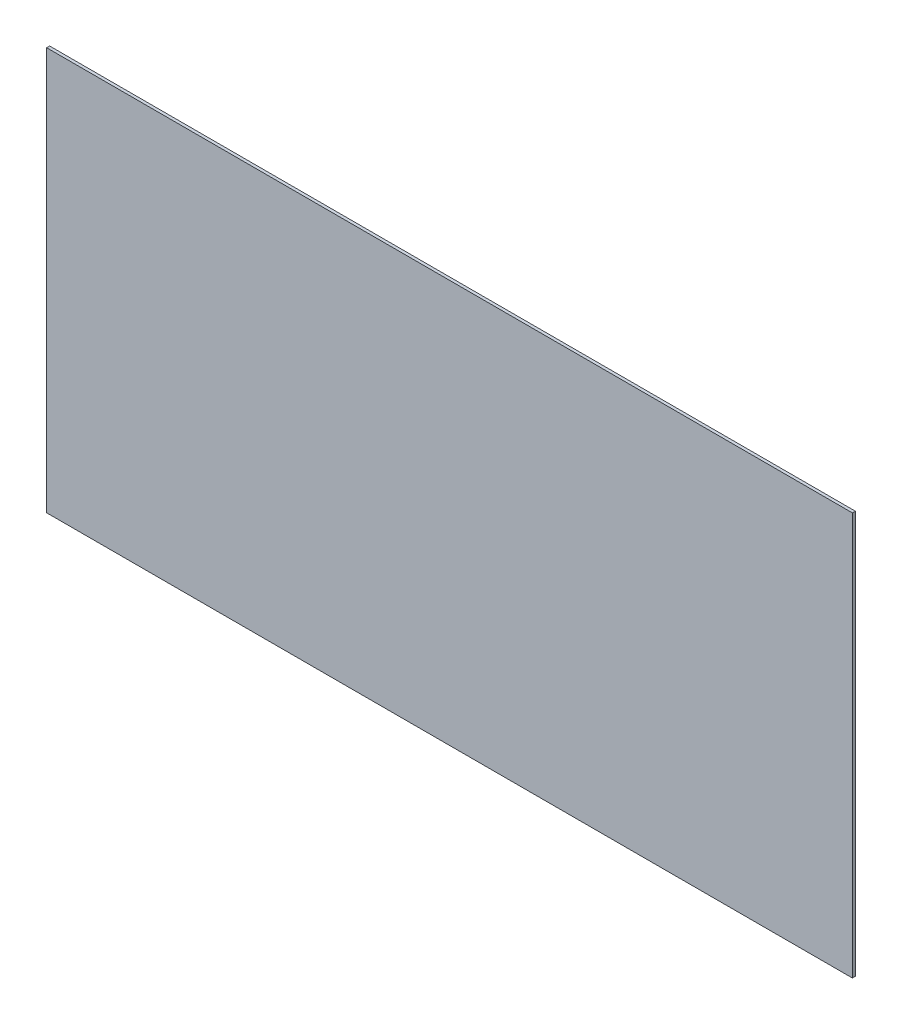
ISO-10303-21;
HEADER;
FILE_DESCRIPTION(('STEP AP214'),'2;1');
FILE_NAME('part.step','',(''),(''),'','','');
FILE_SCHEMA(('AUTOMOTIVE_DESIGN { 1 0 10303 214 1 1 1 1 }'));
ENDSEC;
DATA;
#1=APPLICATION_CONTEXT('core data for automotive mechanical design processes');
#2=APPLICATION_PROTOCOL_DEFINITION('international standard','automotive_design',2000,#1);
#3=PRODUCT_CONTEXT('',#1,'mechanical');
#4=PRODUCT('Part','Part','',(#3));
#5=PRODUCT_RELATED_PRODUCT_CATEGORY('part','',(#4));
#6=PRODUCT_DEFINITION_FORMATION('','',#4);
#7=PRODUCT_DEFINITION_CONTEXT('part definition',#1,'design');
#8=PRODUCT_DEFINITION('design','',#6,#7);
#9=PRODUCT_DEFINITION_SHAPE('','',#8);
#10=(LENGTH_UNIT() NAMED_UNIT(*) SI_UNIT(.MILLI.,.METRE.));
#11=(NAMED_UNIT(*) PLANE_ANGLE_UNIT() SI_UNIT($,.RADIAN.));
#12=(NAMED_UNIT(*) SI_UNIT($,.STERADIAN.) SOLID_ANGLE_UNIT());
#13=UNCERTAINTY_MEASURE_WITH_UNIT(LENGTH_MEASURE(1.E-05),#10,'distance_accuracy_value','');
#14=(GEOMETRIC_REPRESENTATION_CONTEXT(3) GLOBAL_UNCERTAINTY_ASSIGNED_CONTEXT((#13)) GLOBAL_UNIT_ASSIGNED_CONTEXT((#10,
#11,#12)) REPRESENTATION_CONTEXT('',''));
#15=CARTESIAN_POINT('',(0.,0.,0.));
#16=DIRECTION('',(0.,0.,1.));
#17=DIRECTION('',(1.,0.,0.));
#18=AXIS2_PLACEMENT_3D('',#15,#16,#17);
#19=CARTESIAN_POINT('',(29.,5.,0.07366));
#20=DIRECTION('',(1.,0.,0.));
#21=DIRECTION('',(0.,0.,-1.));
#22=AXIS2_PLACEMENT_3D('',#19,#20,#21);
#23=PLANE('',#22);
#24=DIRECTION('',(0.,-1.,0.));
#25=VECTOR('',#24,1.);
#26=CARTESIAN_POINT('',(29.,5.,0.));
#27=LINE('',#26,#25);
#28=CARTESIAN_POINT('',(29.,5.,0.));
#29=VERTEX_POINT('',#28);
#30=CARTESIAN_POINT('',(29.,-5.,0.));
#31=VERTEX_POINT('',#30);
#32=EDGE_CURVE('E113',#29,#31,#27,.T.);
#33=ORIENTED_EDGE('',*,*,#32,.T.);
#34=DIRECTION('',(0.,0.,-1.));
#35=VECTOR('',#34,1.);
#36=CARTESIAN_POINT('',(29.,-5.,0.07366));
#37=LINE('',#36,#35);
#38=CARTESIAN_POINT('',(29.,-5.,0.07366));
#39=VERTEX_POINT('',#38);
#40=EDGE_CURVE('E11',#39,#31,#37,.T.);
#41=ORIENTED_EDGE('',*,*,#40,.F.);
#42=DIRECTION('',(0.,-1.,0.));
#43=VECTOR('',#42,1.);
#44=CARTESIAN_POINT('',(29.,5.,0.07366));
#45=LINE('',#44,#43);
#46=CARTESIAN_POINT('',(29.,5.,0.07366));
#47=VERTEX_POINT('',#46);
#48=EDGE_CURVE('E97',#47,#39,#45,.T.);
#49=ORIENTED_EDGE('',*,*,#48,.F.);
#50=DIRECTION('',(0.,0.,-1.));
#51=VECTOR('',#50,1.);
#52=CARTESIAN_POINT('',(29.,5.,0.07366));
#53=LINE('',#52,#51);
#54=EDGE_CURVE('E109',#47,#29,#53,.T.);
#55=ORIENTED_EDGE('',*,*,#54,.T.);
#56=EDGE_LOOP('',(#33,#41,#49,#55));
#57=FACE_BOUND('',#56,.T.);
#58=ADVANCED_FACE('F45',(#57),#23,.F.);
#59=CARTESIAN_POINT('',(29.,-5.,0.07366));
#60=DIRECTION('',(0.,1.,0.));
#61=DIRECTION('',(0.,0.,1.));
#62=AXIS2_PLACEMENT_3D('',#59,#60,#61);
#63=PLANE('',#62);
#64=DIRECTION('',(1.,0.,0.));
#65=VECTOR('',#64,1.);
#66=CARTESIAN_POINT('',(29.,-5.,0.));
#67=LINE('',#66,#65);
#68=CARTESIAN_POINT('',(49.,-5.,0.));
#69=VERTEX_POINT('',#68);
#70=EDGE_CURVE('E102',#31,#69,#67,.T.);
#71=ORIENTED_EDGE('',*,*,#70,.T.);
#72=DIRECTION('',(0.,0.,-1.));
#73=VECTOR('',#72,1.);
#74=CARTESIAN_POINT('',(49.,-5.,0.07366));
#75=LINE('',#74,#73);
#76=CARTESIAN_POINT('',(49.,-5.,0.07366));
#77=VERTEX_POINT('',#76);
#78=EDGE_CURVE('E54',#77,#69,#75,.T.);
#79=ORIENTED_EDGE('',*,*,#78,.F.);
#80=DIRECTION('',(1.,0.,0.));
#81=VECTOR('',#80,1.);
#82=CARTESIAN_POINT('',(29.,-5.,0.07366));
#83=LINE('',#82,#81);
#84=EDGE_CURVE('E92',#39,#77,#83,.T.);
#85=ORIENTED_EDGE('',*,*,#84,.F.);
#86=ORIENTED_EDGE('',*,*,#40,.T.);
#87=EDGE_LOOP('',(#71,#79,#85,#86));
#88=FACE_BOUND('',#87,.T.);
#89=ADVANCED_FACE('F101',(#88),#63,.F.);
#90=CARTESIAN_POINT('',(49.,5.,0.07366));
#91=DIRECTION('',(-1.,0.,0.));
#92=DIRECTION('',(0.,0.,1.));
#93=AXIS2_PLACEMENT_3D('',#90,#91,#92);
#94=PLANE('',#93);
#95=DIRECTION('',(0.,1.,0.));
#96=VECTOR('',#95,1.);
#97=CARTESIAN_POINT('',(49.,5.,0.));
#98=LINE('',#97,#96);
#99=CARTESIAN_POINT('',(49.,5.,0.));
#100=VERTEX_POINT('',#99);
#101=EDGE_CURVE('E79',#69,#100,#98,.T.);
#102=ORIENTED_EDGE('',*,*,#101,.T.);
#103=DIRECTION('',(0.,0.,-1.));
#104=VECTOR('',#103,1.);
#105=CARTESIAN_POINT('',(49.,5.,0.07366));
#106=LINE('',#105,#104);
#107=CARTESIAN_POINT('',(49.,5.,0.07366));
#108=VERTEX_POINT('',#107);
#109=EDGE_CURVE('E104',#108,#100,#106,.T.);
#110=ORIENTED_EDGE('',*,*,#109,.F.);
#111=DIRECTION('',(0.,1.,0.));
#112=VECTOR('',#111,1.);
#113=CARTESIAN_POINT('',(49.,5.,0.07366));
#114=LINE('',#113,#112);
#115=EDGE_CURVE('E95',#77,#108,#114,.T.);
#116=ORIENTED_EDGE('',*,*,#115,.F.);
#117=ORIENTED_EDGE('',*,*,#78,.T.);
#118=EDGE_LOOP('',(#102,#110,#116,#117));
#119=FACE_BOUND('',#118,.T.);
#120=ADVANCED_FACE('F105',(#119),#94,.F.);
#121=CARTESIAN_POINT('',(29.,5.,0.07366));
#122=DIRECTION('',(0.,-1.,0.));
#123=DIRECTION('',(0.,0.,-1.));
#124=AXIS2_PLACEMENT_3D('',#121,#122,#123);
#125=PLANE('',#124);
#126=DIRECTION('',(-1.,0.,0.));
#127=VECTOR('',#126,1.);
#128=CARTESIAN_POINT('',(29.,5.,0.));
#129=LINE('',#128,#127);
#130=EDGE_CURVE('E85',#100,#29,#129,.T.);
#131=ORIENTED_EDGE('',*,*,#130,.T.);
#132=ORIENTED_EDGE('',*,*,#54,.F.);
#133=DIRECTION('',(-1.,0.,0.));
#134=VECTOR('',#133,1.);
#135=CARTESIAN_POINT('',(29.,5.,0.07366));
#136=LINE('',#135,#134);
#137=EDGE_CURVE('E62',#108,#47,#136,.T.);
#138=ORIENTED_EDGE('',*,*,#137,.F.);
#139=ORIENTED_EDGE('',*,*,#109,.T.);
#140=EDGE_LOOP('',(#131,#132,#138,#139));
#141=FACE_BOUND('',#140,.T.);
#142=ADVANCED_FACE('F126',(#141),#125,.F.);
#143=CARTESIAN_POINT('',(0.,0.,0.07366));
#144=DIRECTION('',(0.,0.,1.));
#145=DIRECTION('',(1.,0.,0.));
#146=AXIS2_PLACEMENT_3D('',#143,#144,#145);
#147=PLANE('',#146);
#148=ORIENTED_EDGE('',*,*,#48,.T.);
#149=ORIENTED_EDGE('',*,*,#84,.T.);
#150=ORIENTED_EDGE('',*,*,#115,.T.);
#151=ORIENTED_EDGE('',*,*,#137,.T.);
#152=EDGE_LOOP('',(#148,#149,#150,#151));
#153=FACE_BOUND('',#152,.T.);
#154=ADVANCED_FACE('F93',(#153),#147,.T.);
#155=CARTESIAN_POINT('',(0.,0.,0.));
#156=DIRECTION('',(0.,0.,1.));
#157=DIRECTION('',(1.,0.,0.));
#158=AXIS2_PLACEMENT_3D('',#155,#156,#157);
#159=PLANE('',#158);
#160=ORIENTED_EDGE('',*,*,#32,.F.);
#161=ORIENTED_EDGE('',*,*,#130,.F.);
#162=ORIENTED_EDGE('',*,*,#101,.F.);
#163=ORIENTED_EDGE('',*,*,#70,.F.);
#164=EDGE_LOOP('',(#160,#161,#162,#163));
#165=FACE_BOUND('',#164,.T.);
#166=ADVANCED_FACE('F129',(#165),#159,.F.);
#167=CLOSED_SHELL('',(#58,#89,#120,#142,#154,#166));
#168=MANIFOLD_SOLID_BREP('B2',#167);
#169=ADVANCED_BREP_SHAPE_REPRESENTATION('',(#18,#168),#14);
#170=SHAPE_DEFINITION_REPRESENTATION(#9,#169);
ENDSEC;
END-ISO-10303-21;
